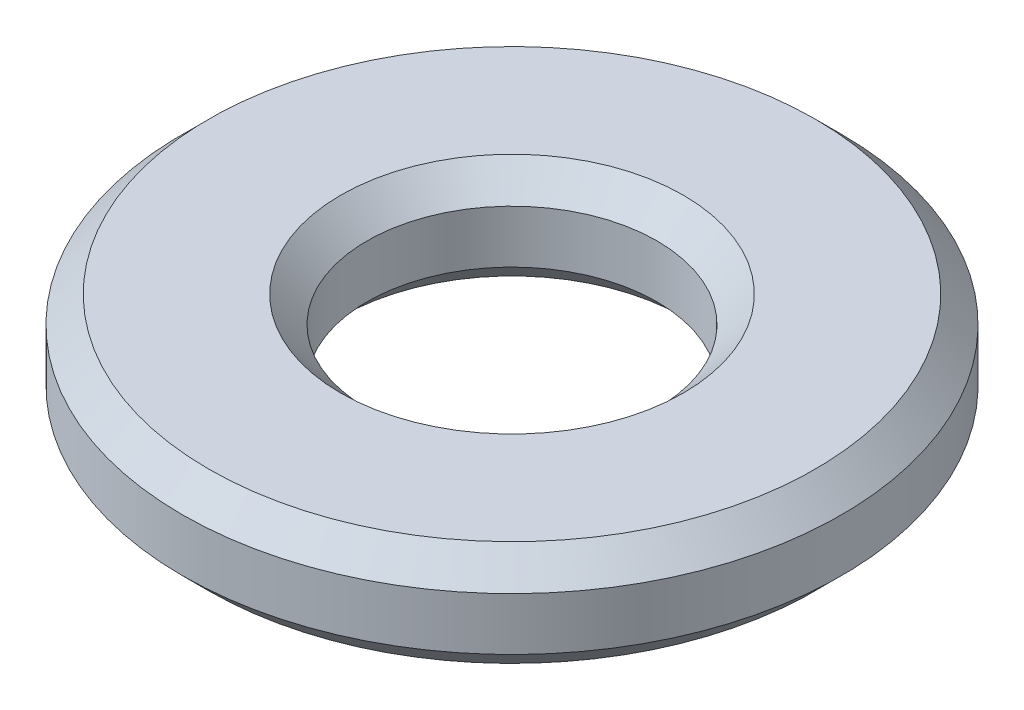
ISO-10303-21;
HEADER;
FILE_DESCRIPTION(('STEP AP214'),'2;1');
FILE_NAME('part.step','',(''),(''),'','','');
FILE_SCHEMA(('AUTOMOTIVE_DESIGN { 1 0 10303 214 1 1 1 1 }'));
ENDSEC;
DATA;
#1=APPLICATION_CONTEXT('core data for automotive mechanical design processes');
#2=APPLICATION_PROTOCOL_DEFINITION('international standard','automotive_design',2000,#1);
#3=PRODUCT_CONTEXT('',#1,'mechanical');
#4=PRODUCT('Part','Part','',(#3));
#5=PRODUCT_RELATED_PRODUCT_CATEGORY('part','',(#4));
#6=PRODUCT_DEFINITION_FORMATION('','',#4);
#7=PRODUCT_DEFINITION_CONTEXT('part definition',#1,'design');
#8=PRODUCT_DEFINITION('design','',#6,#7);
#9=PRODUCT_DEFINITION_SHAPE('','',#8);
#10=(LENGTH_UNIT() NAMED_UNIT(*) SI_UNIT(.MILLI.,.METRE.));
#11=(NAMED_UNIT(*) PLANE_ANGLE_UNIT() SI_UNIT($,.RADIAN.));
#12=(NAMED_UNIT(*) SI_UNIT($,.STERADIAN.) SOLID_ANGLE_UNIT());
#13=UNCERTAINTY_MEASURE_WITH_UNIT(LENGTH_MEASURE(1.E-05),#10,'distance_accuracy_value','');
#14=(GEOMETRIC_REPRESENTATION_CONTEXT(3) GLOBAL_UNCERTAINTY_ASSIGNED_CONTEXT((#13)) GLOBAL_UNIT_ASSIGNED_CONTEXT((#10,
#11,#12)) REPRESENTATION_CONTEXT('',''));
#15=CARTESIAN_POINT('',(0.,0.,0.));
#16=DIRECTION('',(0.,0.,1.));
#17=DIRECTION('',(1.,0.,0.));
#18=AXIS2_PLACEMENT_3D('',#15,#16,#17);
#19=CARTESIAN_POINT('',(0.,0.8,0.));
#20=DIRECTION('',(0.,1.,0.));
#21=DIRECTION('',(0.,0.,1.));
#22=AXIS2_PLACEMENT_3D('',#19,#20,#21);
#23=PLANE('',#22);
#24=CARTESIAN_POINT('',(0.,0.8,0.));
#25=DIRECTION('',(0.,1.,0.));
#26=DIRECTION('',(0.,0.,1.));
#27=AXIS2_PLACEMENT_3D('',#24,#25,#26);
#28=CIRCLE('',#27,1.3);
#29=CARTESIAN_POINT('',(0.,0.8,1.3));
#30=VERTEX_POINT('',#29);
#31=EDGE_CURVE('E10',#30,#30,#28,.F.);
#32=ORIENTED_EDGE('',*,*,#31,.T.);
#33=EDGE_LOOP('',(#32));
#34=FACE_BOUND('',#33,.T.);
#35=CARTESIAN_POINT('',(0.,0.8,0.));
#36=DIRECTION('',(0.,1.,0.));
#37=DIRECTION('',(0.,0.,1.));
#38=AXIS2_PLACEMENT_3D('',#35,#36,#37);
#39=CIRCLE('',#38,2.3);
#40=CARTESIAN_POINT('',(0.,0.8,2.3));
#41=VERTEX_POINT('',#40);
#42=EDGE_CURVE('E42',#41,#41,#39,.T.);
#43=ORIENTED_EDGE('',*,*,#42,.T.);
#44=EDGE_LOOP('',(#43));
#45=FACE_BOUND('',#44,.T.);
#46=ADVANCED_FACE('F35',(#34,#45),#23,.T.);
#47=CARTESIAN_POINT('',(0.,0.,0.));
#48=DIRECTION('',(0.,1.,0.));
#49=DIRECTION('',(0.,0.,1.));
#50=AXIS2_PLACEMENT_3D('',#47,#48,#49);
#51=PLANE('',#50);
#52=CARTESIAN_POINT('',(0.,0.,0.));
#53=DIRECTION('',(0.,1.,0.));
#54=DIRECTION('',(0.,0.,1.));
#55=AXIS2_PLACEMENT_3D('',#52,#53,#54);
#56=CIRCLE('',#55,1.3);
#57=CARTESIAN_POINT('',(0.,0.,-1.3));
#58=VERTEX_POINT('',#57);
#59=EDGE_CURVE('E61',#58,#58,#56,.T.);
#60=ORIENTED_EDGE('',*,*,#59,.T.);
#61=EDGE_LOOP('',(#60));
#62=FACE_BOUND('',#61,.T.);
#63=CARTESIAN_POINT('',(0.,0.,0.));
#64=DIRECTION('',(0.,1.,0.));
#65=DIRECTION('',(0.,0.,1.));
#66=AXIS2_PLACEMENT_3D('',#63,#64,#65);
#67=CIRCLE('',#66,2.3);
#68=CARTESIAN_POINT('',(0.,0.,2.3));
#69=VERTEX_POINT('',#68);
#70=EDGE_CURVE('E64',#69,#69,#67,.F.);
#71=ORIENTED_EDGE('',*,*,#70,.T.);
#72=EDGE_LOOP('',(#71));
#73=FACE_BOUND('',#72,.T.);
#74=ADVANCED_FACE('F68',(#62,#73),#51,.F.);
#75=CARTESIAN_POINT('',(0.,0.8,0.));
#76=DIRECTION('',(0.,-1.,0.));
#77=DIRECTION('',(0.,0.,-1.));
#78=AXIS2_PLACEMENT_3D('',#75,#76,#77);
#79=CYLINDRICAL_SURFACE('',#78,2.5);
#80=CARTESIAN_POINT('',(0.,0.200000000000001,0.));
#81=DIRECTION('',(0.,1.,0.));
#82=DIRECTION('',(0.,0.,1.));
#83=AXIS2_PLACEMENT_3D('',#80,#81,#82);
#84=CIRCLE('',#83,2.5);
#85=CARTESIAN_POINT('',(0.,0.200000000000001,2.5));
#86=VERTEX_POINT('',#85);
#87=EDGE_CURVE('E46',#86,#86,#84,.T.);
#88=ORIENTED_EDGE('',*,*,#87,.T.);
#89=EDGE_LOOP('',(#88));
#90=FACE_BOUND('',#89,.T.);
#91=CARTESIAN_POINT('',(0.,0.599999999999999,0.));
#92=DIRECTION('',(0.,1.,0.));
#93=DIRECTION('',(0.,0.,1.));
#94=AXIS2_PLACEMENT_3D('',#91,#92,#93);
#95=CIRCLE('',#94,2.5);
#96=CARTESIAN_POINT('',(0.,0.599999999999999,2.5));
#97=VERTEX_POINT('',#96);
#98=EDGE_CURVE('E50',#97,#97,#95,.F.);
#99=ORIENTED_EDGE('',*,*,#98,.T.);
#100=EDGE_LOOP('',(#99));
#101=FACE_BOUND('',#100,.T.);
#102=ADVANCED_FACE('F78',(#90,#101),#79,.T.);
#103=CARTESIAN_POINT('',(0.,0.8,0.));
#104=DIRECTION('',(0.,-1.,0.));
#105=DIRECTION('',(0.,0.,-1.));
#106=AXIS2_PLACEMENT_3D('',#103,#104,#105);
#107=CYLINDRICAL_SURFACE('',#106,1.1);
#108=CARTESIAN_POINT('',(0.,0.2,0.));
#109=DIRECTION('',(0.,1.,0.));
#110=DIRECTION('',(0.,0.,1.));
#111=AXIS2_PLACEMENT_3D('',#108,#109,#110);
#112=CIRCLE('',#111,1.1);
#113=CARTESIAN_POINT('',(0.,0.2,-1.1));
#114=VERTEX_POINT('',#113);
#115=EDGE_CURVE('E55',#114,#114,#112,.F.);
#116=CARTESIAN_POINT('',(0.,0.6,0.));
#117=DIRECTION('',(0.,1.,0.));
#118=DIRECTION('',(0.,0.,1.));
#119=AXIS2_PLACEMENT_3D('',#116,#117,#118);
#120=CIRCLE('',#119,1.1);
#121=CARTESIAN_POINT('',(0.,0.6,-1.1));
#122=VERTEX_POINT('',#121);
#123=EDGE_CURVE('E58',#122,#122,#120,.T.);
#124=CARTESIAN_POINT('',(0.,0.2,-1.1));
#125=CARTESIAN_POINT('',(0.,0.204166666666666,-1.1));
#126=CARTESIAN_POINT('',(0.,0.208333333333333,-1.1));
#127=CARTESIAN_POINT('',(0.,0.216666666666666,-1.1));
#128=CARTESIAN_POINT('',(0.,0.220833333333333,-1.1));
#129=CARTESIAN_POINT('',(0.,0.229166666666666,-1.1));
#130=CARTESIAN_POINT('',(0.,0.233333333333333,-1.1));
#131=CARTESIAN_POINT('',(0.,0.241666666666666,-1.1));
#132=CARTESIAN_POINT('',(0.,0.245833333333333,-1.1));
#133=CARTESIAN_POINT('',(0.,0.254166666666666,-1.1));
#134=CARTESIAN_POINT('',(0.,0.258333333333333,-1.1));
#135=CARTESIAN_POINT('',(0.,0.266666666666666,-1.1));
#136=CARTESIAN_POINT('',(0.,0.270833333333333,-1.1));
#137=CARTESIAN_POINT('',(0.,0.279166666666667,-1.1));
#138=CARTESIAN_POINT('',(0.,0.283333333333333,-1.1));
#139=CARTESIAN_POINT('',(0.,0.291666666666667,-1.1));
#140=CARTESIAN_POINT('',(0.,0.295833333333333,-1.1));
#141=CARTESIAN_POINT('',(0.,0.304166666666667,-1.1));
#142=CARTESIAN_POINT('',(0.,0.308333333333333,-1.1));
#143=CARTESIAN_POINT('',(0.,0.316666666666667,-1.1));
#144=CARTESIAN_POINT('',(0.,0.320833333333333,-1.1));
#145=CARTESIAN_POINT('',(0.,0.329166666666667,-1.1));
#146=CARTESIAN_POINT('',(0.,0.333333333333333,-1.1));
#147=CARTESIAN_POINT('',(0.,0.341666666666667,-1.1));
#148=CARTESIAN_POINT('',(0.,0.345833333333333,-1.1));
#149=CARTESIAN_POINT('',(0.,0.354166666666667,-1.1));
#150=CARTESIAN_POINT('',(0.,0.358333333333333,-1.1));
#151=CARTESIAN_POINT('',(0.,0.366666666666667,-1.1));
#152=CARTESIAN_POINT('',(0.,0.370833333333333,-1.1));
#153=CARTESIAN_POINT('',(0.,0.379166666666667,-1.1));
#154=CARTESIAN_POINT('',(0.,0.383333333333333,-1.1));
#155=CARTESIAN_POINT('',(0.,0.391666666666667,-1.1));
#156=CARTESIAN_POINT('',(0.,0.395833333333333,-1.1));
#157=CARTESIAN_POINT('',(0.,0.404166666666667,-1.1));
#158=CARTESIAN_POINT('',(0.,0.408333333333333,-1.1));
#159=CARTESIAN_POINT('',(0.,0.416666666666667,-1.1));
#160=CARTESIAN_POINT('',(0.,0.420833333333333,-1.1));
#161=CARTESIAN_POINT('',(0.,0.429166666666667,-1.1));
#162=CARTESIAN_POINT('',(0.,0.433333333333333,-1.1));
#163=CARTESIAN_POINT('',(0.,0.441666666666667,-1.1));
#164=CARTESIAN_POINT('',(0.,0.445833333333333,-1.1));
#165=CARTESIAN_POINT('',(0.,0.454166666666667,-1.1));
#166=CARTESIAN_POINT('',(0.,0.458333333333333,-1.1));
#167=CARTESIAN_POINT('',(0.,0.466666666666667,-1.1));
#168=CARTESIAN_POINT('',(0.,0.470833333333333,-1.1));
#169=CARTESIAN_POINT('',(0.,0.479166666666667,-1.1));
#170=CARTESIAN_POINT('',(0.,0.483333333333333,-1.1));
#171=CARTESIAN_POINT('',(0.,0.491666666666667,-1.1));
#172=CARTESIAN_POINT('',(0.,0.495833333333333,-1.1));
#173=CARTESIAN_POINT('',(0.,0.504166666666667,-1.1));
#174=CARTESIAN_POINT('',(0.,0.508333333333333,-1.1));
#175=CARTESIAN_POINT('',(0.,0.516666666666667,-1.1));
#176=CARTESIAN_POINT('',(0.,0.520833333333333,-1.1));
#177=CARTESIAN_POINT('',(0.,0.529166666666667,-1.1));
#178=CARTESIAN_POINT('',(0.,0.533333333333333,-1.1));
#179=CARTESIAN_POINT('',(0.,0.541666666666667,-1.1));
#180=CARTESIAN_POINT('',(0.,0.545833333333333,-1.1));
#181=CARTESIAN_POINT('',(0.,0.554166666666667,-1.1));
#182=CARTESIAN_POINT('',(0.,0.558333333333333,-1.1));
#183=CARTESIAN_POINT('',(0.,0.566666666666667,-1.1));
#184=CARTESIAN_POINT('',(0.,0.570833333333333,-1.1));
#185=CARTESIAN_POINT('',(0.,0.579166666666667,-1.1));
#186=CARTESIAN_POINT('',(0.,0.583333333333333,-1.1));
#187=CARTESIAN_POINT('',(0.,0.591666666666667,-1.1));
#188=CARTESIAN_POINT('',(0.,0.595833333333333,-1.1));
#189=CARTESIAN_POINT('',(0.,0.6,-1.1));
#190=B_SPLINE_CURVE_WITH_KNOTS('',3,(#124,#125,#126,#127,#128,#129,#130,#131,#132,#133,#134,
#135,#136,#137,#138,#139,#140,#141,#142,#143,#144,#145,#146,#147,#148,#149,#150,#151,#152,#153,
#154,#155,#156,#157,#158,#159,#160,#161,#162,#163,#164,#165,#166,#167,#168,#169,#170,#171,#172,
#173,#174,#175,#176,#177,#178,#179,#180,#181,#182,#183,#184,#185,#186,#187,#188,#189),
.UNSPECIFIED.,.F.,.F.,(4,2,2,2,2,2,2,2,2,2,2,2,2,2,2,2,2,2,2,2,2,2,2,2,2,2,2,2,2,2,2,2,4),(0.,
0.0125,0.0250000000000001,0.0375,0.05,0.0625000000000001,0.0750000000000001,0.0875000000000001,
0.1,0.1125,0.125,0.1375,0.15,0.1625,0.175,0.1875,0.2,0.2125,0.225,0.2375,0.25,0.2625,0.275,
0.2875,0.3,0.3125,0.325,0.3375,0.35,0.3625,0.375,0.3875,0.4),.UNSPECIFIED.);
#191=EDGE_CURVE('BSEAM81',#114,#122,#190,.T.);
#192=ORIENTED_EDGE('',*,*,#115,.T.);
#193=ORIENTED_EDGE('',*,*,#123,.T.);
#194=ORIENTED_EDGE('',*,*,#191,.T.);
#195=ORIENTED_EDGE('',*,*,#191,.F.);
#196=EDGE_LOOP('',(#192,#194,#193,#195));
#197=FACE_BOUND('',#196,.T.);
#198=ADVANCED_FACE('F81',(#197),#107,.F.);
#199=CARTESIAN_POINT('',(0.,0.,0.));
#200=DIRECTION('',(0.,-1.,0.));
#201=DIRECTION('',(0.,0.,-1.));
#202=AXIS2_PLACEMENT_3D('',#199,#200,#201);
#203=CONICAL_SURFACE('',#202,1.3,0.785398163397448);
#204=CARTESIAN_POINT('',(0.,0.2,-1.1));
#205=CARTESIAN_POINT('',(0.,0.197916666666666,-1.10208333333333));
#206=CARTESIAN_POINT('',(0.,0.195833333333333,-1.10416666666667));
#207=CARTESIAN_POINT('',(0.,0.191666666666667,-1.10833333333333));
#208=CARTESIAN_POINT('',(0.,0.189583333333333,-1.11041666666667));
#209=CARTESIAN_POINT('',(0.,0.185416666666667,-1.11458333333333));
#210=CARTESIAN_POINT('',(0.,0.183333333333333,-1.11666666666667));
#211=CARTESIAN_POINT('',(0.,0.179166666666667,-1.12083333333333));
#212=CARTESIAN_POINT('',(0.,0.177083333333333,-1.12291666666667));
#213=CARTESIAN_POINT('',(0.,0.172916666666667,-1.12708333333333));
#214=CARTESIAN_POINT('',(0.,0.170833333333333,-1.12916666666667));
#215=CARTESIAN_POINT('',(0.,0.166666666666667,-1.13333333333333));
#216=CARTESIAN_POINT('',(0.,0.164583333333333,-1.13541666666667));
#217=CARTESIAN_POINT('',(0.,0.160416666666667,-1.13958333333333));
#218=CARTESIAN_POINT('',(0.,0.158333333333333,-1.14166666666667));
#219=CARTESIAN_POINT('',(0.,0.154166666666667,-1.14583333333333));
#220=CARTESIAN_POINT('',(0.,0.152083333333333,-1.14791666666667));
#221=CARTESIAN_POINT('',(0.,0.147916666666667,-1.15208333333333));
#222=CARTESIAN_POINT('',(0.,0.145833333333333,-1.15416666666667));
#223=CARTESIAN_POINT('',(0.,0.141666666666667,-1.15833333333333));
#224=CARTESIAN_POINT('',(0.,0.139583333333333,-1.16041666666667));
#225=CARTESIAN_POINT('',(0.,0.135416666666667,-1.16458333333333));
#226=CARTESIAN_POINT('',(0.,0.133333333333333,-1.16666666666667));
#227=CARTESIAN_POINT('',(0.,0.129166666666667,-1.17083333333333));
#228=CARTESIAN_POINT('',(0.,0.127083333333333,-1.17291666666667));
#229=CARTESIAN_POINT('',(0.,0.122916666666667,-1.17708333333333));
#230=CARTESIAN_POINT('',(0.,0.120833333333333,-1.17916666666667));
#231=CARTESIAN_POINT('',(0.,0.116666666666667,-1.18333333333333));
#232=CARTESIAN_POINT('',(0.,0.114583333333333,-1.18541666666667));
#233=CARTESIAN_POINT('',(0.,0.110416666666667,-1.18958333333333));
#234=CARTESIAN_POINT('',(0.,0.108333333333333,-1.19166666666667));
#235=CARTESIAN_POINT('',(0.,0.104166666666667,-1.19583333333333));
#236=CARTESIAN_POINT('',(0.,0.102083333333333,-1.19791666666667));
#237=CARTESIAN_POINT('',(0.,0.0979166666666666,-1.20208333333333));
#238=CARTESIAN_POINT('',(0.,0.0958333333333333,-1.20416666666667));
#239=CARTESIAN_POINT('',(0.,0.0916666666666666,-1.20833333333333));
#240=CARTESIAN_POINT('',(0.,0.0895833333333333,-1.21041666666667));
#241=CARTESIAN_POINT('',(0.,0.0854166666666666,-1.21458333333333));
#242=CARTESIAN_POINT('',(0.,0.0833333333333333,-1.21666666666667));
#243=CARTESIAN_POINT('',(0.,0.0791666666666666,-1.22083333333333));
#244=CARTESIAN_POINT('',(0.,0.0770833333333333,-1.22291666666667));
#245=CARTESIAN_POINT('',(0.,0.0729166666666666,-1.22708333333333));
#246=CARTESIAN_POINT('',(0.,0.0708333333333333,-1.22916666666667));
#247=CARTESIAN_POINT('',(0.,0.0666666666666666,-1.23333333333333));
#248=CARTESIAN_POINT('',(0.,0.0645833333333332,-1.23541666666667));
#249=CARTESIAN_POINT('',(0.,0.0604166666666666,-1.23958333333333));
#250=CARTESIAN_POINT('',(0.,0.0583333333333333,-1.24166666666667));
#251=CARTESIAN_POINT('',(0.,0.0541666666666666,-1.24583333333333));
#252=CARTESIAN_POINT('',(0.,0.0520833333333333,-1.24791666666667));
#253=CARTESIAN_POINT('',(0.,0.0479166666666666,-1.25208333333333));
#254=CARTESIAN_POINT('',(0.,0.0458333333333333,-1.25416666666667));
#255=CARTESIAN_POINT('',(0.,0.0416666666666666,-1.25833333333333));
#256=CARTESIAN_POINT('',(0.,0.0395833333333333,-1.26041666666667));
#257=CARTESIAN_POINT('',(0.,0.0354166666666666,-1.26458333333333));
#258=CARTESIAN_POINT('',(0.,0.0333333333333333,-1.26666666666667));
#259=CARTESIAN_POINT('',(0.,0.0291666666666666,-1.27083333333333));
#260=CARTESIAN_POINT('',(0.,0.0270833333333333,-1.27291666666667));
#261=CARTESIAN_POINT('',(0.,0.0229166666666666,-1.27708333333333));
#262=CARTESIAN_POINT('',(0.,0.0208333333333333,-1.27916666666667));
#263=CARTESIAN_POINT('',(0.,0.0166666666666666,-1.28333333333333));
#264=CARTESIAN_POINT('',(0.,0.0145833333333333,-1.28541666666667));
#265=CARTESIAN_POINT('',(0.,0.0104166666666667,-1.28958333333333));
#266=CARTESIAN_POINT('',(0.,0.00833333333333333,-1.29166666666667));
#267=CARTESIAN_POINT('',(0.,0.00416666666666665,-1.29583333333333));
#268=CARTESIAN_POINT('',(0.,0.00208333333333331,-1.29791666666667));
#269=CARTESIAN_POINT('',(0.,0.,-1.3));
#270=B_SPLINE_CURVE_WITH_KNOTS('',3,(#204,#205,#206,#207,#208,#209,#210,#211,#212,#213,#214,
#215,#216,#217,#218,#219,#220,#221,#222,#223,#224,#225,#226,#227,#228,#229,#230,#231,#232,#233,
#234,#235,#236,#237,#238,#239,#240,#241,#242,#243,#244,#245,#246,#247,#248,#249,#250,#251,#252,
#253,#254,#255,#256,#257,#258,#259,#260,#261,#262,#263,#264,#265,#266,#267,#268,#269),
.UNSPECIFIED.,.F.,.F.,(4,2,2,2,2,2,2,2,2,2,2,2,2,2,2,2,2,2,2,2,2,2,2,2,2,2,2,2,2,2,2,2,4),(0.,
0.00883883476483181,0.0176776695296636,0.0265165042944954,0.0353553390593274,0.0441941738241592,
0.053033008588991,0.0618718433538229,0.0707106781186547,0.0795495128834865,0.0883883476483183,
0.0972271824131503,0.106066017177982,0.114904851942814,0.123743686707646,0.132582521472478,
0.14142135623731,0.150260191002141,0.159099025766973,0.167937860531805,0.176776695296637,
0.185615530061469,0.1944543648263,0.203293199591132,0.212132034355964,0.220970869120796,
0.229809703885628,0.23864853865046,0.247487373415291,0.256326208180123,0.265165042944955,
0.274003877709787,0.282842712474619),.UNSPECIFIED.);
#271=EDGE_CURVE('BSEAM74',#114,#58,#270,.T.);
#272=ORIENTED_EDGE('',*,*,#115,.F.);
#273=ORIENTED_EDGE('',*,*,#59,.F.);
#274=ORIENTED_EDGE('',*,*,#271,.T.);
#275=ORIENTED_EDGE('',*,*,#271,.F.);
#276=EDGE_LOOP('',(#272,#274,#273,#275));
#277=FACE_BOUND('',#276,.T.);
#278=ADVANCED_FACE('F74',(#277),#203,.F.);
#279=CARTESIAN_POINT('',(0.,0.200000000000001,0.));
#280=DIRECTION('',(0.,1.,0.));
#281=DIRECTION('',(0.,0.,1.));
#282=AXIS2_PLACEMENT_3D('',#279,#280,#281);
#283=CONICAL_SURFACE('',#282,2.5,0.78539816339745);
#284=ORIENTED_EDGE('',*,*,#70,.F.);
#285=EDGE_LOOP('',(#284));
#286=FACE_BOUND('',#285,.T.);
#287=ORIENTED_EDGE('',*,*,#87,.F.);
#288=EDGE_LOOP('',(#287));
#289=FACE_BOUND('',#288,.T.);
#290=ADVANCED_FACE('F70',(#286,#289),#283,.T.);
#291=CARTESIAN_POINT('',(0.,0.6,0.));
#292=DIRECTION('',(0.,1.,0.));
#293=DIRECTION('',(0.,0.,1.));
#294=AXIS2_PLACEMENT_3D('',#291,#292,#293);
#295=CONICAL_SURFACE('',#294,1.1,0.785398163397448);
#296=ORIENTED_EDGE('',*,*,#31,.F.);
#297=EDGE_LOOP('',(#296));
#298=FACE_BOUND('',#297,.T.);
#299=ORIENTED_EDGE('',*,*,#123,.F.);
#300=EDGE_LOOP('',(#299));
#301=FACE_BOUND('',#300,.T.);
#302=ADVANCED_FACE('F73',(#298,#301),#295,.F.);
#303=CARTESIAN_POINT('',(0.,0.8,0.));
#304=DIRECTION('',(0.,-1.,0.));
#305=DIRECTION('',(0.,0.,-1.));
#306=AXIS2_PLACEMENT_3D('',#303,#304,#305);
#307=CONICAL_SURFACE('',#306,2.3,0.785398163397447);
#308=ORIENTED_EDGE('',*,*,#98,.F.);
#309=EDGE_LOOP('',(#308));
#310=FACE_BOUND('',#309,.T.);
#311=ORIENTED_EDGE('',*,*,#42,.F.);
#312=EDGE_LOOP('',(#311));
#313=FACE_BOUND('',#312,.T.);
#314=ADVANCED_FACE('F37',(#310,#313),#307,.T.);
#315=CLOSED_SHELL('',(#46,#74,#102,#198,#278,#290,#302,#314));
#316=MANIFOLD_SOLID_BREP('B2',#315);
#317=ADVANCED_BREP_SHAPE_REPRESENTATION('',(#18,#316),#14);
#318=SHAPE_DEFINITION_REPRESENTATION(#9,#317);
ENDSEC;
END-ISO-10303-21;
